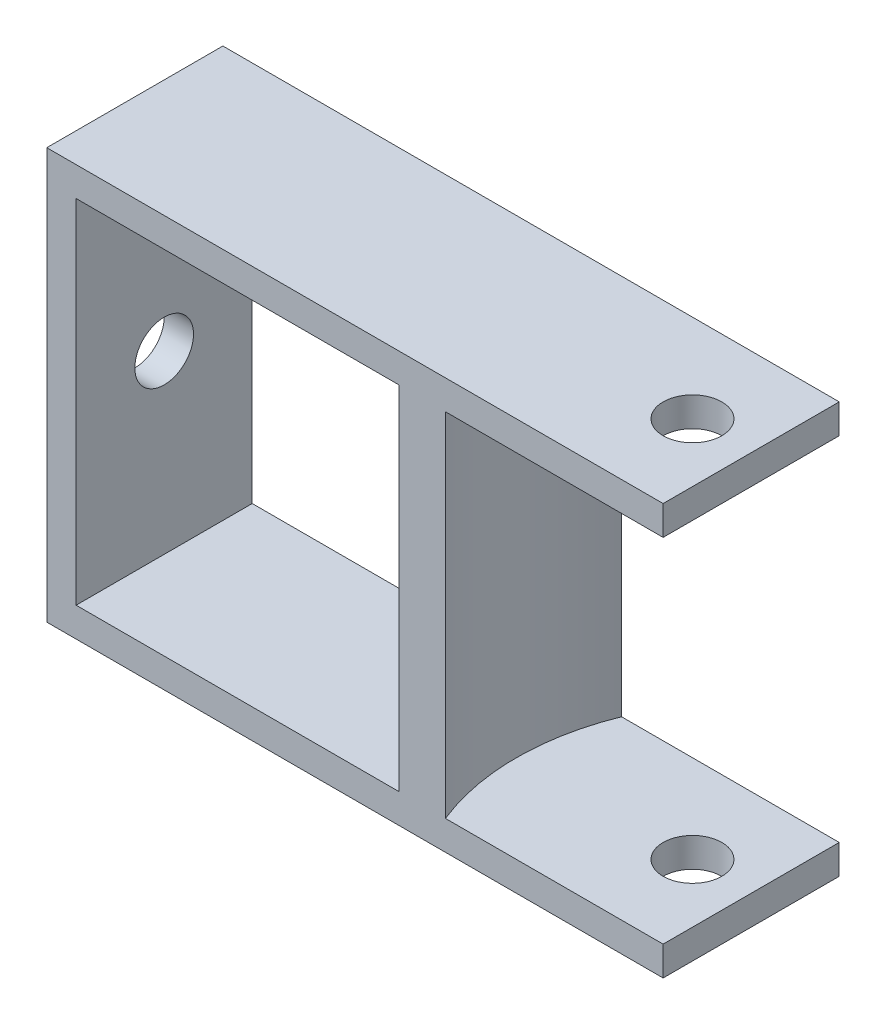
ISO-10303-21;
HEADER;
FILE_DESCRIPTION(('STEP AP214'),'2;1');
FILE_NAME('part.step','',(''),(''),'','','');
FILE_SCHEMA(('AUTOMOTIVE_DESIGN { 1 0 10303 214 1 1 1 1 }'));
ENDSEC;
DATA;
#1=APPLICATION_CONTEXT('core data for automotive mechanical design processes');
#2=APPLICATION_PROTOCOL_DEFINITION('international standard','automotive_design',2000,#1);
#3=PRODUCT_CONTEXT('',#1,'mechanical');
#4=PRODUCT('Part','Part','',(#3));
#5=PRODUCT_RELATED_PRODUCT_CATEGORY('part','',(#4));
#6=PRODUCT_DEFINITION_FORMATION('','',#4);
#7=PRODUCT_DEFINITION_CONTEXT('part definition',#1,'design');
#8=PRODUCT_DEFINITION('design','',#6,#7);
#9=PRODUCT_DEFINITION_SHAPE('','',#8);
#10=(LENGTH_UNIT() NAMED_UNIT(*) SI_UNIT(.MILLI.,.METRE.));
#11=(NAMED_UNIT(*) PLANE_ANGLE_UNIT() SI_UNIT($,.RADIAN.));
#12=(NAMED_UNIT(*) SI_UNIT($,.STERADIAN.) SOLID_ANGLE_UNIT());
#13=UNCERTAINTY_MEASURE_WITH_UNIT(LENGTH_MEASURE(1.E-05),#10,'distance_accuracy_value','');
#14=(GEOMETRIC_REPRESENTATION_CONTEXT(3) GLOBAL_UNCERTAINTY_ASSIGNED_CONTEXT((#13)) GLOBAL_UNIT_ASSIGNED_CONTEXT((#10,
#11,#12)) REPRESENTATION_CONTEXT('',''));
#15=CARTESIAN_POINT('',(0.,0.,0.));
#16=DIRECTION('',(0.,0.,1.));
#17=DIRECTION('',(1.,0.,0.));
#18=AXIS2_PLACEMENT_3D('',#15,#16,#17);
#19=CARTESIAN_POINT('',(66.7646869718569,70.,8.89112903225806));
#20=DIRECTION('',(-1.,0.,0.));
#21=DIRECTION('',(0.,0.,1.));
#22=AXIS2_PLACEMENT_3D('',#19,#20,#21);
#23=PLANE('',#22);
#24=DIRECTION('',(0.,0.,1.));
#25=VECTOR('',#24,1.);
#26=CARTESIAN_POINT('',(66.7646869718569,65.,8.89112903225806));
#27=LINE('',#26,#25);
#28=CARTESIAN_POINT('',(66.7646869718569,65.,-21.1088709677419));
#29=VERTEX_POINT('',#28);
#30=CARTESIAN_POINT('',(66.7646869718569,65.,8.89112903225806));
#31=VERTEX_POINT('',#30);
#32=EDGE_CURVE('E174',#29,#31,#27,.T.);
#33=ORIENTED_EDGE('',*,*,#32,.F.);
#34=DIRECTION('',(0.,-1.,0.));
#35=VECTOR('',#34,1.);
#36=CARTESIAN_POINT('',(66.7646869718569,70.,-21.1088709677419));
#37=LINE('',#36,#35);
#38=CARTESIAN_POINT('',(66.7646869718569,70.,-21.1088709677419));
#39=VERTEX_POINT('',#38);
#40=EDGE_CURVE('E220',#39,#29,#37,.T.);
#41=ORIENTED_EDGE('',*,*,#40,.F.);
#42=DIRECTION('',(0.,0.,-1.));
#43=VECTOR('',#42,1.);
#44=CARTESIAN_POINT('',(66.7646869718569,70.,8.89112903225806));
#45=LINE('',#44,#43);
#46=CARTESIAN_POINT('',(66.7646869718569,70.,8.89112903225806));
#47=VERTEX_POINT('',#46);
#48=EDGE_CURVE('E203',#47,#39,#45,.T.);
#49=ORIENTED_EDGE('',*,*,#48,.F.);
#50=DIRECTION('',(0.,-1.,0.));
#51=VECTOR('',#50,1.);
#52=CARTESIAN_POINT('',(66.7646869718569,70.,8.89112903225806));
#53=LINE('',#52,#51);
#54=EDGE_CURVE('E224',#47,#31,#53,.T.);
#55=ORIENTED_EDGE('',*,*,#54,.T.);
#56=EDGE_LOOP('',(#33,#41,#49,#55));
#57=FACE_BOUND('',#56,.T.);
#58=ADVANCED_FACE('F36',(#57),#23,.F.);
#59=CARTESIAN_POINT('',(56.7646869718569,70.,-6.10887096774194));
#60=DIRECTION('',(0.,-1.,0.));
#61=DIRECTION('',(0.,0.,-1.));
#62=AXIS2_PLACEMENT_3D('',#59,#60,#61);
#63=CYLINDRICAL_SURFACE('',#62,5.);
#64=CARTESIAN_POINT('',(56.7646869718569,70.,-6.10887096774194));
#65=DIRECTION('',(0.,1.,0.));
#66=DIRECTION('',(0.,0.,1.));
#67=AXIS2_PLACEMENT_3D('',#64,#65,#66);
#68=CIRCLE('',#67,5.);
#69=CARTESIAN_POINT('',(56.7646869718569,70.,-1.10887096774194));
#70=VERTEX_POINT('',#69);
#71=EDGE_CURVE('E191',#70,#70,#68,.T.);
#72=ORIENTED_EDGE('',*,*,#71,.T.);
#73=EDGE_LOOP('',(#72));
#74=FACE_BOUND('',#73,.T.);
#75=CARTESIAN_POINT('',(56.7646869718569,65.,-6.10887096774194));
#76=DIRECTION('',(0.,-1.,0.));
#77=DIRECTION('',(0.,0.,-1.));
#78=AXIS2_PLACEMENT_3D('',#75,#76,#77);
#79=CIRCLE('',#78,5.);
#80=CARTESIAN_POINT('',(56.7646869718569,65.,-11.1088709677419));
#81=VERTEX_POINT('',#80);
#82=EDGE_CURVE('E171',#81,#81,#79,.T.);
#83=ORIENTED_EDGE('',*,*,#82,.T.);
#84=EDGE_LOOP('',(#83));
#85=FACE_BOUND('',#84,.T.);
#86=ADVANCED_FACE('F242',(#74,#85),#63,.F.);
#87=CARTESIAN_POINT('',(0.,70.,0.));
#88=DIRECTION('',(0.,-1.,0.));
#89=DIRECTION('',(0.,0.,-1.));
#90=AXIS2_PLACEMENT_3D('',#87,#88,#89);
#91=PLANE('',#90);
#92=DIRECTION('',(0.,0.,1.));
#93=VECTOR('',#92,1.);
#94=CARTESIAN_POINT('',(-38.2353130281431,70.,8.89112903225806));
#95=LINE('',#94,#93);
#96=CARTESIAN_POINT('',(-38.2353130281431,70.,-21.1088709677419));
#97=VERTEX_POINT('',#96);
#98=CARTESIAN_POINT('',(-38.2353130281431,70.,8.89112903225806));
#99=VERTEX_POINT('',#98);
#100=EDGE_CURVE('E197',#97,#99,#95,.T.);
#101=ORIENTED_EDGE('',*,*,#100,.T.);
#102=DIRECTION('',(1.,0.,0.));
#103=VECTOR('',#102,1.);
#104=CARTESIAN_POINT('',(-38.2353130281431,70.,8.89112903225806));
#105=LINE('',#104,#103);
#106=EDGE_CURVE('E200',#99,#47,#105,.T.);
#107=ORIENTED_EDGE('',*,*,#106,.T.);
#108=ORIENTED_EDGE('',*,*,#48,.T.);
#109=DIRECTION('',(-1.,0.,0.));
#110=VECTOR('',#109,1.);
#111=CARTESIAN_POINT('',(-38.2353130281431,70.,-21.1088709677419));
#112=LINE('',#111,#110);
#113=EDGE_CURVE('E205',#39,#97,#112,.T.);
#114=ORIENTED_EDGE('',*,*,#113,.T.);
#115=EDGE_LOOP('',(#101,#107,#108,#114));
#116=FACE_BOUND('',#115,.T.);
#117=ORIENTED_EDGE('',*,*,#71,.F.);
#118=EDGE_LOOP('',(#117));
#119=FACE_BOUND('',#118,.T.);
#120=ADVANCED_FACE('F247',(#116,#119),#91,.F.);
#121=CARTESIAN_POINT('',(0.,0.,0.));
#122=DIRECTION('',(0.,-1.,0.));
#123=DIRECTION('',(0.,0.,-1.));
#124=AXIS2_PLACEMENT_3D('',#121,#122,#123);
#125=PLANE('',#124);
#126=DIRECTION('',(0.,0.,1.));
#127=VECTOR('',#126,1.);
#128=CARTESIAN_POINT('',(-38.2353130281431,0.,8.89112903225806));
#129=LINE('',#128,#127);
#130=CARTESIAN_POINT('',(-38.2353130281431,0.,-21.1088709677419));
#131=VERTEX_POINT('',#130);
#132=CARTESIAN_POINT('',(-38.2353130281431,0.,8.89112903225806));
#133=VERTEX_POINT('',#132);
#134=EDGE_CURVE('E194',#131,#133,#129,.T.);
#135=ORIENTED_EDGE('',*,*,#134,.F.);
#136=DIRECTION('',(-1.,0.,0.));
#137=VECTOR('',#136,1.);
#138=CARTESIAN_POINT('',(-38.2353130281431,0.,-21.1088709677419));
#139=LINE('',#138,#137);
#140=CARTESIAN_POINT('',(66.7646869718569,0.,-21.1088709677419));
#141=VERTEX_POINT('',#140);
#142=EDGE_CURVE('E201',#141,#131,#139,.T.);
#143=ORIENTED_EDGE('',*,*,#142,.F.);
#144=DIRECTION('',(0.,0.,-1.));
#145=VECTOR('',#144,1.);
#146=CARTESIAN_POINT('',(66.7646869718569,0.,8.89112903225806));
#147=LINE('',#146,#145);
#148=CARTESIAN_POINT('',(66.7646869718569,0.,8.89112903225806));
#149=VERTEX_POINT('',#148);
#150=EDGE_CURVE('E213',#149,#141,#147,.T.);
#151=ORIENTED_EDGE('',*,*,#150,.F.);
#152=DIRECTION('',(1.,0.,0.));
#153=VECTOR('',#152,1.);
#154=CARTESIAN_POINT('',(-38.2353130281431,0.,8.89112903225806));
#155=LINE('',#154,#153);
#156=EDGE_CURVE('E210',#133,#149,#155,.T.);
#157=ORIENTED_EDGE('',*,*,#156,.F.);
#158=EDGE_LOOP('',(#135,#143,#151,#157));
#159=FACE_BOUND('',#158,.T.);
#160=CARTESIAN_POINT('',(56.7646869718569,0.,-6.10887096774194));
#161=DIRECTION('',(0.,1.,0.));
#162=DIRECTION('',(0.,0.,1.));
#163=AXIS2_PLACEMENT_3D('',#160,#161,#162);
#164=CIRCLE('',#163,5.);
#165=CARTESIAN_POINT('',(56.7646869718569,0.,-1.10887096774194));
#166=VERTEX_POINT('',#165);
#167=EDGE_CURVE('E190',#166,#166,#164,.T.);
#168=ORIENTED_EDGE('',*,*,#167,.T.);
#169=EDGE_LOOP('',(#168));
#170=FACE_BOUND('',#169,.T.);
#171=ADVANCED_FACE('F245',(#159,#170),#125,.T.);
#172=CARTESIAN_POINT('',(-38.2353130281431,70.,8.89112903225806));
#173=DIRECTION('',(1.,0.,0.));
#174=DIRECTION('',(0.,0.,-1.));
#175=AXIS2_PLACEMENT_3D('',#172,#173,#174);
#176=PLANE('',#175);
#177=CARTESIAN_POINT('',(-38.2353130281431,35.,-6.10887096774194));
#178=DIRECTION('',(-1.,0.,0.));
#179=DIRECTION('',(0.,0.,1.));
#180=AXIS2_PLACEMENT_3D('',#177,#178,#179);
#181=CIRCLE('',#180,5.);
#182=CARTESIAN_POINT('',(-38.2353130281431,35.,-1.10887096774194));
#183=VERTEX_POINT('',#182);
#184=EDGE_CURVE('E163',#183,#183,#181,.T.);
#185=ORIENTED_EDGE('',*,*,#184,.F.);
#186=EDGE_LOOP('',(#185));
#187=FACE_BOUND('',#186,.T.);
#188=ORIENTED_EDGE('',*,*,#134,.T.);
#189=DIRECTION('',(0.,-1.,0.));
#190=VECTOR('',#189,1.);
#191=CARTESIAN_POINT('',(-38.2353130281431,70.,8.89112903225806));
#192=LINE('',#191,#190);
#193=EDGE_CURVE('E45',#99,#133,#192,.T.);
#194=ORIENTED_EDGE('',*,*,#193,.F.);
#195=ORIENTED_EDGE('',*,*,#100,.F.);
#196=DIRECTION('',(0.,-1.,0.));
#197=VECTOR('',#196,1.);
#198=CARTESIAN_POINT('',(-38.2353130281431,70.,-21.1088709677419));
#199=LINE('',#198,#197);
#200=EDGE_CURVE('E207',#97,#131,#199,.T.);
#201=ORIENTED_EDGE('',*,*,#200,.T.);
#202=EDGE_LOOP('',(#188,#194,#195,#201));
#203=FACE_BOUND('',#202,.T.);
#204=ADVANCED_FACE('F38',(#187,#203),#176,.F.);
#205=CARTESIAN_POINT('',(-38.2353130281431,70.,8.89112903225806));
#206=DIRECTION('',(0.,0.,-1.));
#207=DIRECTION('',(-1.,0.,0.));
#208=AXIS2_PLACEMENT_3D('',#205,#206,#207);
#209=PLANE('',#208);
#210=DIRECTION('',(1.,0.,0.));
#211=VECTOR('',#210,1.);
#212=CARTESIAN_POINT('',(-33.2353130281431,5.,8.89112903225806));
#213=LINE('',#212,#211);
#214=CARTESIAN_POINT('',(-33.2353130281431,5.,8.89112903225806));
#215=VERTEX_POINT('',#214);
#216=CARTESIAN_POINT('',(21.7646869718569,5.,8.89112903225806));
#217=VERTEX_POINT('',#216);
#218=EDGE_CURVE('E154',#215,#217,#213,.T.);
#219=ORIENTED_EDGE('',*,*,#218,.F.);
#220=DIRECTION('',(0.,-1.,0.));
#221=VECTOR('',#220,1.);
#222=CARTESIAN_POINT('',(-33.2353130281431,65.,8.89112903225806));
#223=LINE('',#222,#221);
#224=CARTESIAN_POINT('',(-33.2353130281431,65.,8.89112903225806));
#225=VERTEX_POINT('',#224);
#226=EDGE_CURVE('E52',#225,#215,#223,.T.);
#227=ORIENTED_EDGE('',*,*,#226,.F.);
#228=DIRECTION('',(-1.,0.,0.));
#229=VECTOR('',#228,1.);
#230=CARTESIAN_POINT('',(-33.2353130281431,65.,8.89112903225806));
#231=LINE('',#230,#229);
#232=CARTESIAN_POINT('',(21.7646869718569,65.,8.89112903225806));
#233=VERTEX_POINT('',#232);
#234=EDGE_CURVE('E145',#233,#225,#231,.T.);
#235=ORIENTED_EDGE('',*,*,#234,.F.);
#236=DIRECTION('',(0.,1.,0.));
#237=VECTOR('',#236,1.);
#238=CARTESIAN_POINT('',(21.7646869718569,65.,8.89112903225806));
#239=LINE('',#238,#237);
#240=EDGE_CURVE('E148',#217,#233,#239,.T.);
#241=ORIENTED_EDGE('',*,*,#240,.F.);
#242=EDGE_LOOP('',(#219,#227,#235,#241));
#243=FACE_BOUND('',#242,.T.);
#244=CARTESIAN_POINT('',(66.7646869718569,5.,8.89112903225806));
#245=VERTEX_POINT('',#244);
#246=EDGE_CURVE('E223',#245,#149,#53,.T.);
#247=ORIENTED_EDGE('',*,*,#246,.F.);
#248=DIRECTION('',(-1.,0.,0.));
#249=VECTOR('',#248,1.);
#250=CARTESIAN_POINT('',(-38.2353130281431,5.,8.89112903225806));
#251=LINE('',#250,#249);
#252=CARTESIAN_POINT('',(29.6836945363785,5.,8.89112903225806));
#253=VERTEX_POINT('',#252);
#254=EDGE_CURVE('E185',#245,#253,#251,.T.);
#255=ORIENTED_EDGE('',*,*,#254,.T.);
#256=DIRECTION('',(0.,1.,0.));
#257=VECTOR('',#256,1.);
#258=CARTESIAN_POINT('',(29.6836945363785,5.,8.89112903225806));
#259=LINE('',#258,#257);
#260=CARTESIAN_POINT('',(29.6836945363785,65.,8.89112903225806));
#261=VERTEX_POINT('',#260);
#262=EDGE_CURVE('E188',#261,#253,#259,.F.);
#263=ORIENTED_EDGE('',*,*,#262,.F.);
#264=DIRECTION('',(-1.,0.,0.));
#265=VECTOR('',#264,1.);
#266=CARTESIAN_POINT('',(-38.2353130281431,65.,8.89112903225806));
#267=LINE('',#266,#265);
#268=EDGE_CURVE('E176',#31,#261,#267,.T.);
#269=ORIENTED_EDGE('',*,*,#268,.F.);
#270=ORIENTED_EDGE('',*,*,#54,.F.);
#271=ORIENTED_EDGE('',*,*,#106,.F.);
#272=ORIENTED_EDGE('',*,*,#193,.T.);
#273=ORIENTED_EDGE('',*,*,#156,.T.);
#274=EDGE_LOOP('',(#247,#255,#263,#269,#270,#271,#272,#273));
#275=FACE_BOUND('',#274,.T.);
#276=ADVANCED_FACE('F254',(#243,#275),#209,.F.);
#277=CARTESIAN_POINT('',(66.7646869718569,5.,-21.1088709677419));
#278=VERTEX_POINT('',#277);
#279=EDGE_CURVE('E219',#278,#141,#37,.T.);
#280=ORIENTED_EDGE('',*,*,#279,.F.);
#281=DIRECTION('',(0.,0.,1.));
#282=VECTOR('',#281,1.);
#283=CARTESIAN_POINT('',(66.7646869718569,5.,8.89112903225806));
#284=LINE('',#283,#282);
#285=EDGE_CURVE('E182',#278,#245,#284,.T.);
#286=ORIENTED_EDGE('',*,*,#285,.T.);
#287=ORIENTED_EDGE('',*,*,#246,.T.);
#288=ORIENTED_EDGE('',*,*,#150,.T.);
#289=EDGE_LOOP('',(#280,#286,#287,#288));
#290=FACE_BOUND('',#289,.T.);
#291=ADVANCED_FACE('F263',(#290),#23,.F.);
#292=CARTESIAN_POINT('',(-38.2353130281431,70.,-21.1088709677419));
#293=DIRECTION('',(0.,0.,1.));
#294=DIRECTION('',(1.,0.,0.));
#295=AXIS2_PLACEMENT_3D('',#292,#293,#294);
#296=PLANE('',#295);
#297=DIRECTION('',(-1.,0.,0.));
#298=VECTOR('',#297,1.);
#299=CARTESIAN_POINT('',(-33.2353130281431,65.,-21.1088709677419));
#300=LINE('',#299,#298);
#301=CARTESIAN_POINT('',(21.7646869718569,65.,-21.1088709677419));
#302=VERTEX_POINT('',#301);
#303=CARTESIAN_POINT('',(-33.2353130281431,65.,-21.1088709677419));
#304=VERTEX_POINT('',#303);
#305=EDGE_CURVE('E135',#302,#304,#300,.T.);
#306=ORIENTED_EDGE('',*,*,#305,.T.);
#307=DIRECTION('',(0.,-1.,0.));
#308=VECTOR('',#307,1.);
#309=CARTESIAN_POINT('',(-33.2353130281431,65.,-21.1088709677419));
#310=LINE('',#309,#308);
#311=CARTESIAN_POINT('',(-33.2353130281431,5.,-21.1088709677419));
#312=VERTEX_POINT('',#311);
#313=EDGE_CURVE('E129',#304,#312,#310,.T.);
#314=ORIENTED_EDGE('',*,*,#313,.T.);
#315=DIRECTION('',(1.,0.,0.));
#316=VECTOR('',#315,1.);
#317=CARTESIAN_POINT('',(-33.2353130281431,5.,-21.1088709677419));
#318=LINE('',#317,#316);
#319=CARTESIAN_POINT('',(21.7646869718569,5.,-21.1088709677419));
#320=VERTEX_POINT('',#319);
#321=EDGE_CURVE('E138',#312,#320,#318,.T.);
#322=ORIENTED_EDGE('',*,*,#321,.T.);
#323=DIRECTION('',(0.,1.,0.));
#324=VECTOR('',#323,1.);
#325=CARTESIAN_POINT('',(21.7646869718569,65.,-21.1088709677419));
#326=LINE('',#325,#324);
#327=EDGE_CURVE('E60',#320,#302,#326,.T.);
#328=ORIENTED_EDGE('',*,*,#327,.T.);
#329=EDGE_LOOP('',(#306,#314,#322,#328));
#330=FACE_BOUND('',#329,.T.);
#331=DIRECTION('',(0.,1.,0.));
#332=VECTOR('',#331,1.);
#333=CARTESIAN_POINT('',(29.6836945363785,5.,-21.1088709677419));
#334=LINE('',#333,#332);
#335=CARTESIAN_POINT('',(29.6836945363785,5.,-21.1088709677419));
#336=VERTEX_POINT('',#335);
#337=CARTESIAN_POINT('',(29.6836945363785,65.,-21.1088709677419));
#338=VERTEX_POINT('',#337);
#339=EDGE_CURVE('E11',#336,#338,#334,.T.);
#340=ORIENTED_EDGE('',*,*,#339,.F.);
#341=DIRECTION('',(1.,0.,0.));
#342=VECTOR('',#341,1.);
#343=CARTESIAN_POINT('',(-38.2353130281431,5.,-21.1088709677419));
#344=LINE('',#343,#342);
#345=EDGE_CURVE('E179',#336,#278,#344,.T.);
#346=ORIENTED_EDGE('',*,*,#345,.T.);
#347=ORIENTED_EDGE('',*,*,#279,.T.);
#348=ORIENTED_EDGE('',*,*,#142,.T.);
#349=ORIENTED_EDGE('',*,*,#200,.F.);
#350=ORIENTED_EDGE('',*,*,#113,.F.);
#351=ORIENTED_EDGE('',*,*,#40,.T.);
#352=DIRECTION('',(1.,0.,0.));
#353=VECTOR('',#352,1.);
#354=CARTESIAN_POINT('',(-38.2353130281431,65.,-21.1088709677419));
#355=LINE('',#354,#353);
#356=EDGE_CURVE('E172',#338,#29,#355,.T.);
#357=ORIENTED_EDGE('',*,*,#356,.F.);
#358=EDGE_LOOP('',(#340,#346,#347,#348,#349,#350,#351,#357));
#359=FACE_BOUND('',#358,.T.);
#360=ADVANCED_FACE('F142',(#330,#359),#296,.F.);
#361=CARTESIAN_POINT('',(56.7646869718569,5.,-6.10887096774194));
#362=DIRECTION('',(0.,-1.,0.));
#363=DIRECTION('',(0.,0.,-1.));
#364=AXIS2_PLACEMENT_3D('',#361,#362,#363);
#365=CIRCLE('',#364,5.);
#366=CARTESIAN_POINT('',(56.7646869718569,5.,-11.1088709677419));
#367=VERTEX_POINT('',#366);
#368=EDGE_CURVE('E178',#367,#367,#365,.T.);
#369=ORIENTED_EDGE('',*,*,#368,.F.);
#370=EDGE_LOOP('',(#369));
#371=FACE_BOUND('',#370,.T.);
#372=ORIENTED_EDGE('',*,*,#167,.F.);
#373=EDGE_LOOP('',(#372));
#374=FACE_BOUND('',#373,.T.);
#375=ADVANCED_FACE('F237',(#371,#374),#63,.F.);
#376=CARTESIAN_POINT('',(66.7646869718569,5.,-6.10887096774194));
#377=DIRECTION('',(0.,1.,0.));
#378=DIRECTION('',(0.,0.,1.));
#379=AXIS2_PLACEMENT_3D('',#376,#377,#378);
#380=CYLINDRICAL_SURFACE('',#379,40.);
#381=ORIENTED_EDGE('',*,*,#262,.T.);
#382=CARTESIAN_POINT('',(66.7646869718569,5.,-6.10887096774194));
#383=DIRECTION('',(0.,-1.,0.));
#384=DIRECTION('',(0.,0.,-1.));
#385=AXIS2_PLACEMENT_3D('',#382,#383,#384);
#386=CIRCLE('',#385,40.);
#387=EDGE_CURVE('E168',#253,#336,#386,.T.);
#388=ORIENTED_EDGE('',*,*,#387,.T.);
#389=ORIENTED_EDGE('',*,*,#339,.T.);
#390=CARTESIAN_POINT('',(66.7646869718569,65.,-6.10887096774194));
#391=DIRECTION('',(0.,-1.,0.));
#392=DIRECTION('',(0.,0.,-1.));
#393=AXIS2_PLACEMENT_3D('',#390,#391,#392);
#394=CIRCLE('',#393,40.);
#395=EDGE_CURVE('E166',#261,#338,#394,.T.);
#396=ORIENTED_EDGE('',*,*,#395,.F.);
#397=EDGE_LOOP('',(#381,#388,#389,#396));
#398=FACE_BOUND('',#397,.T.);
#399=ADVANCED_FACE('F240',(#398),#380,.F.);
#400=CARTESIAN_POINT('',(66.7646869718569,5.,-6.10887096774194));
#401=DIRECTION('',(0.,-1.,0.));
#402=DIRECTION('',(0.,0.,-1.));
#403=AXIS2_PLACEMENT_3D('',#400,#401,#402);
#404=PLANE('',#403);
#405=ORIENTED_EDGE('',*,*,#368,.T.);
#406=EDGE_LOOP('',(#405));
#407=FACE_BOUND('',#406,.T.);
#408=ORIENTED_EDGE('',*,*,#285,.F.);
#409=ORIENTED_EDGE('',*,*,#345,.F.);
#410=ORIENTED_EDGE('',*,*,#387,.F.);
#411=ORIENTED_EDGE('',*,*,#254,.F.);
#412=EDGE_LOOP('',(#408,#409,#410,#411));
#413=FACE_BOUND('',#412,.T.);
#414=ADVANCED_FACE('F234',(#407,#413),#404,.F.);
#415=CARTESIAN_POINT('',(66.7646869718569,65.,-6.10887096774194));
#416=DIRECTION('',(0.,-1.,0.));
#417=DIRECTION('',(0.,0.,-1.));
#418=AXIS2_PLACEMENT_3D('',#415,#416,#417);
#419=PLANE('',#418);
#420=ORIENTED_EDGE('',*,*,#82,.F.);
#421=EDGE_LOOP('',(#420));
#422=FACE_BOUND('',#421,.T.);
#423=ORIENTED_EDGE('',*,*,#268,.T.);
#424=ORIENTED_EDGE('',*,*,#395,.T.);
#425=ORIENTED_EDGE('',*,*,#356,.T.);
#426=ORIENTED_EDGE('',*,*,#32,.T.);
#427=EDGE_LOOP('',(#423,#424,#425,#426));
#428=FACE_BOUND('',#427,.T.);
#429=ADVANCED_FACE('F298',(#422,#428),#419,.T.);
#430=CARTESIAN_POINT('',(-8.23531302814314,35.,-6.10887096774194));
#431=DIRECTION('',(-1.,0.,0.));
#432=DIRECTION('',(0.,0.,1.));
#433=AXIS2_PLACEMENT_3D('',#430,#431,#432);
#434=CYLINDRICAL_SURFACE('',#433,5.);
#435=CARTESIAN_POINT('',(-33.2353130281431,35.,-6.10887096774194));
#436=DIRECTION('',(-1.,0.,0.));
#437=DIRECTION('',(0.,-1.,0.));
#438=AXIS2_PLACEMENT_3D('',#435,#436,#437);
#439=CIRCLE('',#438,5.);
#440=CARTESIAN_POINT('',(-33.2353130281431,30.,-6.10887096774194));
#441=VERTEX_POINT('',#440);
#442=EDGE_CURVE('E40',#441,#441,#439,.F.);
#443=ORIENTED_EDGE('',*,*,#442,.T.);
#444=EDGE_LOOP('',(#443));
#445=FACE_BOUND('',#444,.T.);
#446=ORIENTED_EDGE('',*,*,#184,.T.);
#447=EDGE_LOOP('',(#446));
#448=FACE_BOUND('',#447,.T.);
#449=ADVANCED_FACE('F300',(#445,#448),#434,.F.);
#450=CARTESIAN_POINT('',(-33.2353130281431,65.,-21.1088709677419));
#451=DIRECTION('',(-1.,0.,0.));
#452=DIRECTION('',(0.,-1.,0.));
#453=AXIS2_PLACEMENT_3D('',#450,#451,#452);
#454=PLANE('',#453);
#455=ORIENTED_EDGE('',*,*,#226,.T.);
#456=DIRECTION('',(0.,0.,1.));
#457=VECTOR('',#456,1.);
#458=CARTESIAN_POINT('',(-33.2353130281431,5.,-21.1088709677419));
#459=LINE('',#458,#457);
#460=EDGE_CURVE('E124',#312,#215,#459,.T.);
#461=ORIENTED_EDGE('',*,*,#460,.F.);
#462=ORIENTED_EDGE('',*,*,#313,.F.);
#463=DIRECTION('',(0.,0.,1.));
#464=VECTOR('',#463,1.);
#465=CARTESIAN_POINT('',(-33.2353130281431,65.,-21.1088709677419));
#466=LINE('',#465,#464);
#467=EDGE_CURVE('E158',#304,#225,#466,.T.);
#468=ORIENTED_EDGE('',*,*,#467,.T.);
#469=EDGE_LOOP('',(#455,#461,#462,#468));
#470=FACE_BOUND('',#469,.T.);
#471=ORIENTED_EDGE('',*,*,#442,.F.);
#472=EDGE_LOOP('',(#471));
#473=FACE_BOUND('',#472,.T.);
#474=ADVANCED_FACE('F126',(#470,#473),#454,.F.);
#475=CARTESIAN_POINT('',(-33.2353130281431,65.,-21.1088709677419));
#476=DIRECTION('',(0.,1.,0.));
#477=DIRECTION('',(0.,0.,1.));
#478=AXIS2_PLACEMENT_3D('',#475,#476,#477);
#479=PLANE('',#478);
#480=ORIENTED_EDGE('',*,*,#234,.T.);
#481=ORIENTED_EDGE('',*,*,#467,.F.);
#482=ORIENTED_EDGE('',*,*,#305,.F.);
#483=DIRECTION('',(0.,0.,1.));
#484=VECTOR('',#483,1.);
#485=CARTESIAN_POINT('',(21.7646869718569,65.,-21.1088709677419));
#486=LINE('',#485,#484);
#487=EDGE_CURVE('E160',#302,#233,#486,.T.);
#488=ORIENTED_EDGE('',*,*,#487,.T.);
#489=EDGE_LOOP('',(#480,#481,#482,#488));
#490=FACE_BOUND('',#489,.T.);
#491=ADVANCED_FACE('F362',(#490),#479,.F.);
#492=CARTESIAN_POINT('',(21.7646869718569,65.,-21.1088709677419));
#493=DIRECTION('',(1.,0.,0.));
#494=DIRECTION('',(0.,1.,0.));
#495=AXIS2_PLACEMENT_3D('',#492,#493,#494);
#496=PLANE('',#495);
#497=ORIENTED_EDGE('',*,*,#240,.T.);
#498=ORIENTED_EDGE('',*,*,#487,.F.);
#499=ORIENTED_EDGE('',*,*,#327,.F.);
#500=DIRECTION('',(0.,0.,1.));
#501=VECTOR('',#500,1.);
#502=CARTESIAN_POINT('',(21.7646869718569,5.,-21.1088709677419));
#503=LINE('',#502,#501);
#504=EDGE_CURVE('E134',#320,#217,#503,.T.);
#505=ORIENTED_EDGE('',*,*,#504,.T.);
#506=EDGE_LOOP('',(#497,#498,#499,#505));
#507=FACE_BOUND('',#506,.T.);
#508=ADVANCED_FACE('F370',(#507),#496,.F.);
#509=CARTESIAN_POINT('',(-33.2353130281431,5.,-21.1088709677419));
#510=DIRECTION('',(0.,-1.,0.));
#511=DIRECTION('',(0.,0.,-1.));
#512=AXIS2_PLACEMENT_3D('',#509,#510,#511);
#513=PLANE('',#512);
#514=ORIENTED_EDGE('',*,*,#218,.T.);
#515=ORIENTED_EDGE('',*,*,#504,.F.);
#516=ORIENTED_EDGE('',*,*,#321,.F.);
#517=ORIENTED_EDGE('',*,*,#460,.T.);
#518=EDGE_LOOP('',(#514,#515,#516,#517));
#519=FACE_BOUND('',#518,.T.);
#520=ADVANCED_FACE('F139',(#519),#513,.F.);
#521=CLOSED_SHELL('',(#58,#86,#120,#171,#204,#276,#291,#360,#375,#399,#414,#429,#449,#474,#491,
#508,#520));
#522=MANIFOLD_SOLID_BREP('B2',#521);
#523=ADVANCED_BREP_SHAPE_REPRESENTATION('',(#18,#522),#14);
#524=SHAPE_DEFINITION_REPRESENTATION(#9,#523);
ENDSEC;
END-ISO-10303-21;
